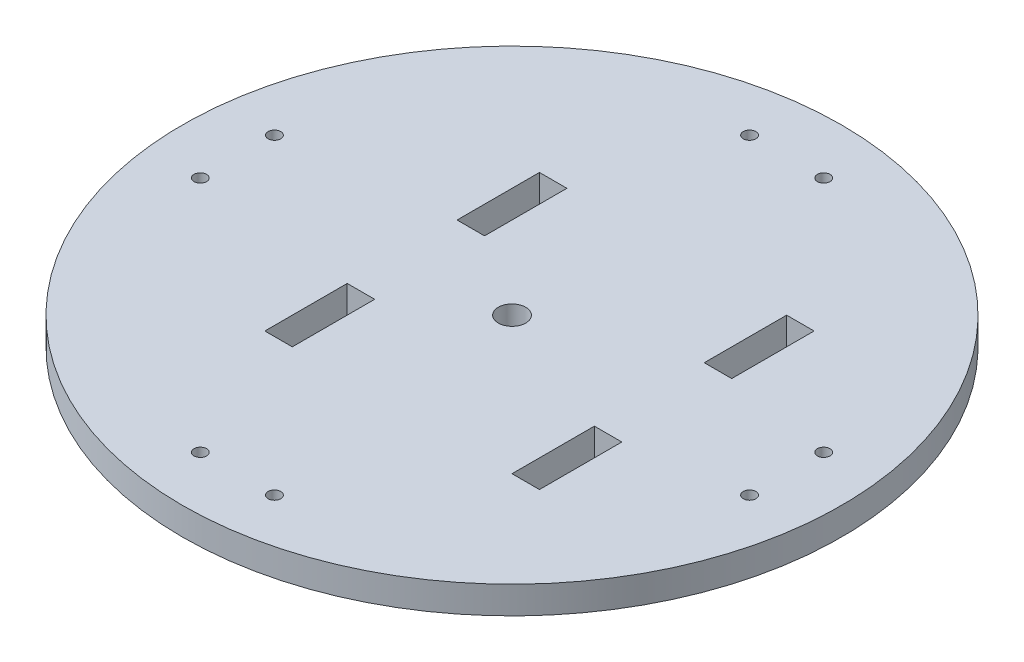
ISO-10303-21;
HEADER;
FILE_DESCRIPTION(('STEP AP214'),'2;1');
FILE_NAME('part.step','',(''),(''),'','','');
FILE_SCHEMA(('AUTOMOTIVE_DESIGN { 1 0 10303 214 1 1 1 1 }'));
ENDSEC;
DATA;
#1=APPLICATION_CONTEXT('core data for automotive mechanical design processes');
#2=APPLICATION_PROTOCOL_DEFINITION('international standard','automotive_design',2000,#1);
#3=PRODUCT_CONTEXT('',#1,'mechanical');
#4=PRODUCT('Part','Part','',(#3));
#5=PRODUCT_RELATED_PRODUCT_CATEGORY('part','',(#4));
#6=PRODUCT_DEFINITION_FORMATION('','',#4);
#7=PRODUCT_DEFINITION_CONTEXT('part definition',#1,'design');
#8=PRODUCT_DEFINITION('design','',#6,#7);
#9=PRODUCT_DEFINITION_SHAPE('','',#8);
#10=(LENGTH_UNIT() NAMED_UNIT(*) SI_UNIT(.MILLI.,.METRE.));
#11=(NAMED_UNIT(*) PLANE_ANGLE_UNIT() SI_UNIT($,.RADIAN.));
#12=(NAMED_UNIT(*) SI_UNIT($,.STERADIAN.) SOLID_ANGLE_UNIT());
#13=UNCERTAINTY_MEASURE_WITH_UNIT(LENGTH_MEASURE(1.E-05),#10,'distance_accuracy_value','');
#14=(GEOMETRIC_REPRESENTATION_CONTEXT(3) GLOBAL_UNCERTAINTY_ASSIGNED_CONTEXT((#13)) GLOBAL_UNIT_ASSIGNED_CONTEXT((#10,
#11,#12)) REPRESENTATION_CONTEXT('',''));
#15=CARTESIAN_POINT('',(0.,0.,0.));
#16=DIRECTION('',(0.,0.,1.));
#17=DIRECTION('',(1.,0.,0.));
#18=AXIS2_PLACEMENT_3D('',#15,#16,#17);
#19=CARTESIAN_POINT('',(0.,5.,0.));
#20=DIRECTION('',(0.,1.,0.));
#21=DIRECTION('',(0.,0.,1.));
#22=AXIS2_PLACEMENT_3D('',#19,#20,#21);
#23=PLANE('',#22);
#24=DIRECTION('',(0.,0.,1.));
#25=VECTOR('',#24,1.);
#26=CARTESIAN_POINT('',(25.,5.,-25.));
#27=LINE('',#26,#25);
#28=CARTESIAN_POINT('',(25.,5.,-25.));
#29=VERTEX_POINT('',#28);
#30=CARTESIAN_POINT('',(25.,5.,-10.));
#31=VERTEX_POINT('',#30);
#32=EDGE_CURVE('E54',#29,#31,#27,.T.);
#33=ORIENTED_EDGE('',*,*,#32,.F.);
#34=DIRECTION('',(-1.,0.,0.));
#35=VECTOR('',#34,1.);
#36=CARTESIAN_POINT('',(25.,5.,-25.));
#37=LINE('',#36,#35);
#38=CARTESIAN_POINT('',(30.,5.,-25.));
#39=VERTEX_POINT('',#38);
#40=EDGE_CURVE('E176',#39,#29,#37,.T.);
#41=ORIENTED_EDGE('',*,*,#40,.F.);
#42=DIRECTION('',(0.,0.,-1.));
#43=VECTOR('',#42,1.);
#44=CARTESIAN_POINT('',(30.,5.,-25.));
#45=LINE('',#44,#43);
#46=CARTESIAN_POINT('',(30.,5.,-10.));
#47=VERTEX_POINT('',#46);
#48=EDGE_CURVE('E180',#47,#39,#45,.T.);
#49=ORIENTED_EDGE('',*,*,#48,.F.);
#50=DIRECTION('',(1.,0.,0.));
#51=VECTOR('',#50,1.);
#52=CARTESIAN_POINT('',(25.,5.,-10.));
#53=LINE('',#52,#51);
#54=EDGE_CURVE('E189',#31,#47,#53,.T.);
#55=ORIENTED_EDGE('',*,*,#54,.F.);
#56=EDGE_LOOP('',(#33,#41,#49,#55));
#57=FACE_BOUND('',#56,.T.);
#58=DIRECTION('',(0.,0.,1.));
#59=VECTOR('',#58,1.);
#60=CARTESIAN_POINT('',(25.,5.,10.));
#61=LINE('',#60,#59);
#62=CARTESIAN_POINT('',(25.,5.,10.));
#63=VERTEX_POINT('',#62);
#64=CARTESIAN_POINT('',(25.,5.,25.));
#65=VERTEX_POINT('',#64);
#66=EDGE_CURVE('E62',#63,#65,#61,.T.);
#67=ORIENTED_EDGE('',*,*,#66,.F.);
#68=DIRECTION('',(-1.,0.,0.));
#69=VECTOR('',#68,1.);
#70=CARTESIAN_POINT('',(25.,5.,10.));
#71=LINE('',#70,#69);
#72=CARTESIAN_POINT('',(30.,5.,10.));
#73=VERTEX_POINT('',#72);
#74=EDGE_CURVE('E210',#73,#63,#71,.T.);
#75=ORIENTED_EDGE('',*,*,#74,.F.);
#76=DIRECTION('',(0.,0.,-1.));
#77=VECTOR('',#76,1.);
#78=CARTESIAN_POINT('',(30.,5.,10.));
#79=LINE('',#78,#77);
#80=CARTESIAN_POINT('',(30.,5.,25.));
#81=VERTEX_POINT('',#80);
#82=EDGE_CURVE('E229',#81,#73,#79,.T.);
#83=ORIENTED_EDGE('',*,*,#82,.F.);
#84=DIRECTION('',(1.,0.,0.));
#85=VECTOR('',#84,1.);
#86=CARTESIAN_POINT('',(25.,5.,25.));
#87=LINE('',#86,#85);
#88=EDGE_CURVE('E225',#65,#81,#87,.T.);
#89=ORIENTED_EDGE('',*,*,#88,.F.);
#90=EDGE_LOOP('',(#67,#75,#83,#89));
#91=FACE_BOUND('',#90,.T.);
#92=DIRECTION('',(0.,0.,1.));
#93=VECTOR('',#92,1.);
#94=CARTESIAN_POINT('',(-20.,5.,-25.));
#95=LINE('',#94,#93);
#96=CARTESIAN_POINT('',(-20.,5.,-25.));
#97=VERTEX_POINT('',#96);
#98=CARTESIAN_POINT('',(-20.,5.,-10.));
#99=VERTEX_POINT('',#98);
#100=EDGE_CURVE('E264',#97,#99,#95,.T.);
#101=ORIENTED_EDGE('',*,*,#100,.F.);
#102=DIRECTION('',(-1.,0.,0.));
#103=VECTOR('',#102,1.);
#104=CARTESIAN_POINT('',(-20.,5.,-25.));
#105=LINE('',#104,#103);
#106=CARTESIAN_POINT('',(-15.,5.,-25.));
#107=VERTEX_POINT('',#106);
#108=EDGE_CURVE('E251',#107,#97,#105,.T.);
#109=ORIENTED_EDGE('',*,*,#108,.F.);
#110=DIRECTION('',(0.,0.,-1.));
#111=VECTOR('',#110,1.);
#112=CARTESIAN_POINT('',(-15.,5.,-25.));
#113=LINE('',#112,#111);
#114=CARTESIAN_POINT('',(-15.,5.,-10.));
#115=VERTEX_POINT('',#114);
#116=EDGE_CURVE('E272',#115,#107,#113,.T.);
#117=ORIENTED_EDGE('',*,*,#116,.F.);
#118=DIRECTION('',(1.,0.,0.));
#119=VECTOR('',#118,1.);
#120=CARTESIAN_POINT('',(-20.,5.,-10.));
#121=LINE('',#120,#119);
#122=EDGE_CURVE('E267',#99,#115,#121,.T.);
#123=ORIENTED_EDGE('',*,*,#122,.F.);
#124=EDGE_LOOP('',(#101,#109,#117,#123));
#125=FACE_BOUND('',#124,.T.);
#126=DIRECTION('',(0.,0.,1.));
#127=VECTOR('',#126,1.);
#128=CARTESIAN_POINT('',(-20.,5.,10.));
#129=LINE('',#128,#127);
#130=CARTESIAN_POINT('',(-20.,5.,10.));
#131=VERTEX_POINT('',#130);
#132=CARTESIAN_POINT('',(-20.,5.,25.));
#133=VERTEX_POINT('',#132);
#134=EDGE_CURVE('E199',#131,#133,#129,.T.);
#135=ORIENTED_EDGE('',*,*,#134,.F.);
#136=DIRECTION('',(-1.,0.,0.));
#137=VECTOR('',#136,1.);
#138=CARTESIAN_POINT('',(-20.,5.,10.));
#139=LINE('',#138,#137);
#140=CARTESIAN_POINT('',(-15.,5.,10.));
#141=VERTEX_POINT('',#140);
#142=EDGE_CURVE('E297',#141,#131,#139,.T.);
#143=ORIENTED_EDGE('',*,*,#142,.F.);
#144=DIRECTION('',(0.,0.,-1.));
#145=VECTOR('',#144,1.);
#146=CARTESIAN_POINT('',(-15.,5.,10.));
#147=LINE('',#146,#145);
#148=CARTESIAN_POINT('',(-15.,5.,25.));
#149=VERTEX_POINT('',#148);
#150=EDGE_CURVE('E316',#149,#141,#147,.T.);
#151=ORIENTED_EDGE('',*,*,#150,.F.);
#152=DIRECTION('',(1.,0.,0.));
#153=VECTOR('',#152,1.);
#154=CARTESIAN_POINT('',(-20.,5.,25.));
#155=LINE('',#154,#153);
#156=EDGE_CURVE('E312',#133,#149,#155,.T.);
#157=ORIENTED_EDGE('',*,*,#156,.F.);
#158=EDGE_LOOP('',(#135,#143,#151,#157));
#159=FACE_BOUND('',#158,.T.);
#160=CARTESIAN_POINT('',(-6.74999999999721,5.,50.0000000000004));
#161=DIRECTION('',(0.,1.,0.));
#162=DIRECTION('',(0.,0.,-1.));
#163=AXIS2_PLACEMENT_3D('',#160,#161,#162);
#164=CIRCLE('',#163,1.14999999999686);
#165=CARTESIAN_POINT('',(-6.74999999999721,5.,48.8500000000035));
#166=VERTEX_POINT('',#165);
#167=EDGE_CURVE('E346',#166,#166,#164,.T.);
#168=ORIENTED_EDGE('',*,*,#167,.F.);
#169=EDGE_LOOP('',(#168));
#170=FACE_BOUND('',#169,.T.);
#171=CARTESIAN_POINT('',(50.0000000000009,5.,-6.7500000000013));
#172=DIRECTION('',(0.,1.,0.));
#173=DIRECTION('',(0.,0.,1.));
#174=AXIS2_PLACEMENT_3D('',#171,#172,#173);
#175=CIRCLE('',#174,1.15);
#176=CARTESIAN_POINT('',(50.0000000000009,5.,-5.6000000000013));
#177=VERTEX_POINT('',#176);
#178=EDGE_CURVE('E363',#177,#177,#175,.T.);
#179=ORIENTED_EDGE('',*,*,#178,.F.);
#180=EDGE_LOOP('',(#179));
#181=FACE_BOUND('',#180,.T.);
#182=CARTESIAN_POINT('',(50.0000000000016,5.,6.7499999999988));
#183=DIRECTION('',(0.,1.,0.));
#184=DIRECTION('',(0.,0.,-1.));
#185=AXIS2_PLACEMENT_3D('',#182,#183,#184);
#186=CIRCLE('',#185,1.14999999999821);
#187=CARTESIAN_POINT('',(50.0000000000016,5.,5.60000000000059));
#188=VERTEX_POINT('',#187);
#189=EDGE_CURVE('E362',#188,#188,#186,.T.);
#190=ORIENTED_EDGE('',*,*,#189,.F.);
#191=EDGE_LOOP('',(#190));
#192=FACE_BOUND('',#191,.T.);
#193=CARTESIAN_POINT('',(6.75000000000001,5.,-50.));
#194=DIRECTION('',(0.,1.,0.));
#195=DIRECTION('',(0.,0.,-1.));
#196=AXIS2_PLACEMENT_3D('',#193,#194,#195);
#197=CIRCLE('',#196,1.15);
#198=CARTESIAN_POINT('',(6.75000000000001,5.,-51.15));
#199=VERTEX_POINT('',#198);
#200=EDGE_CURVE('E379',#199,#199,#197,.T.);
#201=ORIENTED_EDGE('',*,*,#200,.F.);
#202=EDGE_LOOP('',(#201));
#203=FACE_BOUND('',#202,.T.);
#204=CARTESIAN_POINT('',(-49.9999999999987,5.,6.75000000000093));
#205=DIRECTION('',(0.,1.,0.));
#206=DIRECTION('',(0.,0.,1.));
#207=AXIS2_PLACEMENT_3D('',#204,#205,#206);
#208=CIRCLE('',#207,1.15);
#209=CARTESIAN_POINT('',(-49.9999999999987,5.,7.90000000000093));
#210=VERTEX_POINT('',#209);
#211=EDGE_CURVE('E282',#210,#210,#208,.T.);
#212=ORIENTED_EDGE('',*,*,#211,.F.);
#213=EDGE_LOOP('',(#212));
#214=FACE_BOUND('',#213,.T.);
#215=CARTESIAN_POINT('',(-49.9999999999988,5.,-6.74999999999841));
#216=DIRECTION('',(0.,1.,0.));
#217=DIRECTION('',(0.,0.,-1.));
#218=AXIS2_PLACEMENT_3D('',#215,#216,#217);
#219=CIRCLE('',#218,1.14999999999829);
#220=CARTESIAN_POINT('',(-49.9999999999988,5.,-7.8999999999967));
#221=VERTEX_POINT('',#220);
#222=EDGE_CURVE('E338',#221,#221,#219,.T.);
#223=ORIENTED_EDGE('',*,*,#222,.F.);
#224=EDGE_LOOP('',(#223));
#225=FACE_BOUND('',#224,.T.);
#226=CARTESIAN_POINT('',(6.75000000000224,5.,49.9999999999996));
#227=DIRECTION('',(0.,1.,0.));
#228=DIRECTION('',(0.,0.,1.));
#229=AXIS2_PLACEMENT_3D('',#226,#227,#228);
#230=CIRCLE('',#229,1.15);
#231=CARTESIAN_POINT('',(6.75000000000224,5.,51.1499999999996));
#232=VERTEX_POINT('',#231);
#233=EDGE_CURVE('E347',#232,#232,#230,.T.);
#234=ORIENTED_EDGE('',*,*,#233,.F.);
#235=EDGE_LOOP('',(#234));
#236=FACE_BOUND('',#235,.T.);
#237=CARTESIAN_POINT('',(-6.74999999999999,5.,-50.));
#238=DIRECTION('',(0.,1.,0.));
#239=DIRECTION('',(0.,0.,1.));
#240=AXIS2_PLACEMENT_3D('',#237,#238,#239);
#241=CIRCLE('',#240,1.15);
#242=CARTESIAN_POINT('',(-6.74999999999999,5.,-48.85));
#243=VERTEX_POINT('',#242);
#244=EDGE_CURVE('E378',#243,#243,#241,.T.);
#245=ORIENTED_EDGE('',*,*,#244,.F.);
#246=EDGE_LOOP('',(#245));
#247=FACE_BOUND('',#246,.T.);
#248=CARTESIAN_POINT('',(0.,5.,0.));
#249=DIRECTION('',(0.,1.,0.));
#250=DIRECTION('',(0.,0.,1.));
#251=AXIS2_PLACEMENT_3D('',#248,#249,#250);
#252=CIRCLE('',#251,60.);
#253=CARTESIAN_POINT('',(0.,5.,60.));
#254=VERTEX_POINT('',#253);
#255=EDGE_CURVE('E11',#254,#254,#252,.T.);
#256=ORIENTED_EDGE('',*,*,#255,.T.);
#257=EDGE_LOOP('',(#256));
#258=FACE_BOUND('',#257,.T.);
#259=CARTESIAN_POINT('',(0.,5.,0.));
#260=DIRECTION('',(0.,1.,0.));
#261=DIRECTION('',(0.,0.,1.));
#262=AXIS2_PLACEMENT_3D('',#259,#260,#261);
#263=CIRCLE('',#262,2.5);
#264=CARTESIAN_POINT('',(0.,5.,2.5));
#265=VERTEX_POINT('',#264);
#266=EDGE_CURVE('E398',#265,#265,#263,.T.);
#267=ORIENTED_EDGE('',*,*,#266,.F.);
#268=EDGE_LOOP('',(#267));
#269=FACE_BOUND('',#268,.T.);
#270=ADVANCED_FACE('F38',(#57,#91,#125,#159,#170,#181,#192,#203,#214,#225,#236,#247,#258,#269),
#23,.T.);
#271=CARTESIAN_POINT('',(0.,0.,0.));
#272=DIRECTION('',(0.,1.,0.));
#273=DIRECTION('',(0.,0.,1.));
#274=AXIS2_PLACEMENT_3D('',#271,#272,#273);
#275=PLANE('',#274);
#276=DIRECTION('',(-1.,0.,0.));
#277=VECTOR('',#276,1.);
#278=CARTESIAN_POINT('',(25.,0.,-25.));
#279=LINE('',#278,#277);
#280=CARTESIAN_POINT('',(30.,0.,-25.));
#281=VERTEX_POINT('',#280);
#282=CARTESIAN_POINT('',(25.,0.,-25.));
#283=VERTEX_POINT('',#282);
#284=EDGE_CURVE('E161',#281,#283,#279,.T.);
#285=ORIENTED_EDGE('',*,*,#284,.T.);
#286=DIRECTION('',(0.,0.,1.));
#287=VECTOR('',#286,1.);
#288=CARTESIAN_POINT('',(25.,0.,-25.));
#289=LINE('',#288,#287);
#290=CARTESIAN_POINT('',(25.,0.,-10.));
#291=VERTEX_POINT('',#290);
#292=EDGE_CURVE('E154',#283,#291,#289,.T.);
#293=ORIENTED_EDGE('',*,*,#292,.T.);
#294=DIRECTION('',(1.,0.,0.));
#295=VECTOR('',#294,1.);
#296=CARTESIAN_POINT('',(25.,0.,-10.));
#297=LINE('',#296,#295);
#298=CARTESIAN_POINT('',(30.,0.,-10.));
#299=VERTEX_POINT('',#298);
#300=EDGE_CURVE('E165',#291,#299,#297,.T.);
#301=ORIENTED_EDGE('',*,*,#300,.T.);
#302=DIRECTION('',(0.,0.,-1.));
#303=VECTOR('',#302,1.);
#304=CARTESIAN_POINT('',(30.,0.,-25.));
#305=LINE('',#304,#303);
#306=EDGE_CURVE('E170',#299,#281,#305,.T.);
#307=ORIENTED_EDGE('',*,*,#306,.T.);
#308=EDGE_LOOP('',(#285,#293,#301,#307));
#309=FACE_BOUND('',#308,.T.);
#310=DIRECTION('',(-1.,0.,0.));
#311=VECTOR('',#310,1.);
#312=CARTESIAN_POINT('',(25.,0.,10.));
#313=LINE('',#312,#311);
#314=CARTESIAN_POINT('',(30.,0.,10.));
#315=VERTEX_POINT('',#314);
#316=CARTESIAN_POINT('',(25.,0.,10.));
#317=VERTEX_POINT('',#316);
#318=EDGE_CURVE('E218',#315,#317,#313,.T.);
#319=ORIENTED_EDGE('',*,*,#318,.T.);
#320=DIRECTION('',(0.,0.,1.));
#321=VECTOR('',#320,1.);
#322=CARTESIAN_POINT('',(25.,0.,10.));
#323=LINE('',#322,#321);
#324=CARTESIAN_POINT('',(25.,0.,25.));
#325=VERTEX_POINT('',#324);
#326=EDGE_CURVE('E205',#317,#325,#323,.T.);
#327=ORIENTED_EDGE('',*,*,#326,.T.);
#328=DIRECTION('',(1.,0.,0.));
#329=VECTOR('',#328,1.);
#330=CARTESIAN_POINT('',(25.,0.,25.));
#331=LINE('',#330,#329);
#332=CARTESIAN_POINT('',(30.,0.,25.));
#333=VERTEX_POINT('',#332);
#334=EDGE_CURVE('E209',#325,#333,#331,.T.);
#335=ORIENTED_EDGE('',*,*,#334,.T.);
#336=DIRECTION('',(0.,0.,-1.));
#337=VECTOR('',#336,1.);
#338=CARTESIAN_POINT('',(30.,0.,10.));
#339=LINE('',#338,#337);
#340=EDGE_CURVE('E214',#333,#315,#339,.T.);
#341=ORIENTED_EDGE('',*,*,#340,.T.);
#342=EDGE_LOOP('',(#319,#327,#335,#341));
#343=FACE_BOUND('',#342,.T.);
#344=DIRECTION('',(-1.,0.,0.));
#345=VECTOR('',#344,1.);
#346=CARTESIAN_POINT('',(-20.,0.,-25.));
#347=LINE('',#346,#345);
#348=CARTESIAN_POINT('',(-15.,0.,-25.));
#349=VERTEX_POINT('',#348);
#350=CARTESIAN_POINT('',(-20.,0.,-25.));
#351=VERTEX_POINT('',#350);
#352=EDGE_CURVE('E259',#349,#351,#347,.T.);
#353=ORIENTED_EDGE('',*,*,#352,.T.);
#354=DIRECTION('',(0.,0.,1.));
#355=VECTOR('',#354,1.);
#356=CARTESIAN_POINT('',(-20.,0.,-25.));
#357=LINE('',#356,#355);
#358=CARTESIAN_POINT('',(-20.,0.,-10.));
#359=VERTEX_POINT('',#358);
#360=EDGE_CURVE('E246',#351,#359,#357,.T.);
#361=ORIENTED_EDGE('',*,*,#360,.T.);
#362=DIRECTION('',(1.,0.,0.));
#363=VECTOR('',#362,1.);
#364=CARTESIAN_POINT('',(-20.,0.,-10.));
#365=LINE('',#364,#363);
#366=CARTESIAN_POINT('',(-15.,0.,-10.));
#367=VERTEX_POINT('',#366);
#368=EDGE_CURVE('E250',#359,#367,#365,.T.);
#369=ORIENTED_EDGE('',*,*,#368,.T.);
#370=DIRECTION('',(0.,0.,-1.));
#371=VECTOR('',#370,1.);
#372=CARTESIAN_POINT('',(-15.,0.,-25.));
#373=LINE('',#372,#371);
#374=EDGE_CURVE('E255',#367,#349,#373,.T.);
#375=ORIENTED_EDGE('',*,*,#374,.T.);
#376=EDGE_LOOP('',(#353,#361,#369,#375));
#377=FACE_BOUND('',#376,.T.);
#378=DIRECTION('',(-1.,0.,0.));
#379=VECTOR('',#378,1.);
#380=CARTESIAN_POINT('',(-20.,0.,10.));
#381=LINE('',#380,#379);
#382=CARTESIAN_POINT('',(-15.,0.,10.));
#383=VERTEX_POINT('',#382);
#384=CARTESIAN_POINT('',(-20.,0.,10.));
#385=VERTEX_POINT('',#384);
#386=EDGE_CURVE('E305',#383,#385,#381,.T.);
#387=ORIENTED_EDGE('',*,*,#386,.T.);
#388=DIRECTION('',(0.,0.,1.));
#389=VECTOR('',#388,1.);
#390=CARTESIAN_POINT('',(-20.,0.,10.));
#391=LINE('',#390,#389);
#392=CARTESIAN_POINT('',(-20.,0.,25.));
#393=VERTEX_POINT('',#392);
#394=EDGE_CURVE('E292',#385,#393,#391,.T.);
#395=ORIENTED_EDGE('',*,*,#394,.T.);
#396=DIRECTION('',(1.,0.,0.));
#397=VECTOR('',#396,1.);
#398=CARTESIAN_POINT('',(-20.,0.,25.));
#399=LINE('',#398,#397);
#400=CARTESIAN_POINT('',(-15.,0.,25.));
#401=VERTEX_POINT('',#400);
#402=EDGE_CURVE('E296',#393,#401,#399,.T.);
#403=ORIENTED_EDGE('',*,*,#402,.T.);
#404=DIRECTION('',(0.,0.,-1.));
#405=VECTOR('',#404,1.);
#406=CARTESIAN_POINT('',(-15.,0.,10.));
#407=LINE('',#406,#405);
#408=EDGE_CURVE('E301',#401,#383,#407,.T.);
#409=ORIENTED_EDGE('',*,*,#408,.T.);
#410=EDGE_LOOP('',(#387,#395,#403,#409));
#411=FACE_BOUND('',#410,.T.);
#412=CARTESIAN_POINT('',(-6.74999999999721,0.,50.0000000000004));
#413=DIRECTION('',(0.,1.,0.));
#414=DIRECTION('',(0.,0.,-1.));
#415=AXIS2_PLACEMENT_3D('',#412,#413,#414);
#416=CIRCLE('',#415,1.14999999999686);
#417=CARTESIAN_POINT('',(-6.74999999999721,0.,48.8500000000035));
#418=VERTEX_POINT('',#417);
#419=EDGE_CURVE('E367',#418,#418,#416,.T.);
#420=ORIENTED_EDGE('',*,*,#419,.T.);
#421=EDGE_LOOP('',(#420));
#422=FACE_BOUND('',#421,.T.);
#423=CARTESIAN_POINT('',(50.0000000000009,0.,-6.7500000000013));
#424=DIRECTION('',(0.,1.,0.));
#425=DIRECTION('',(0.,0.,1.));
#426=AXIS2_PLACEMENT_3D('',#423,#424,#425);
#427=CIRCLE('',#426,1.15);
#428=CARTESIAN_POINT('',(50.0000000000009,0.,-5.6000000000013));
#429=VERTEX_POINT('',#428);
#430=EDGE_CURVE('E358',#429,#429,#427,.T.);
#431=ORIENTED_EDGE('',*,*,#430,.T.);
#432=EDGE_LOOP('',(#431));
#433=FACE_BOUND('',#432,.T.);
#434=CARTESIAN_POINT('',(50.0000000000016,0.,6.7499999999988));
#435=DIRECTION('',(0.,1.,0.));
#436=DIRECTION('',(0.,0.,-1.));
#437=AXIS2_PLACEMENT_3D('',#434,#435,#436);
#438=CIRCLE('',#437,1.14999999999821);
#439=CARTESIAN_POINT('',(50.0000000000016,0.,5.60000000000059));
#440=VERTEX_POINT('',#439);
#441=EDGE_CURVE('E383',#440,#440,#438,.T.);
#442=ORIENTED_EDGE('',*,*,#441,.T.);
#443=EDGE_LOOP('',(#442));
#444=FACE_BOUND('',#443,.T.);
#445=CARTESIAN_POINT('',(6.75000000000001,0.,-50.));
#446=DIRECTION('',(0.,1.,0.));
#447=DIRECTION('',(0.,0.,-1.));
#448=AXIS2_PLACEMENT_3D('',#445,#446,#447);
#449=CIRCLE('',#448,1.15);
#450=CARTESIAN_POINT('',(6.75000000000001,0.,-51.15));
#451=VERTEX_POINT('',#450);
#452=EDGE_CURVE('E374',#451,#451,#449,.T.);
#453=ORIENTED_EDGE('',*,*,#452,.T.);
#454=EDGE_LOOP('',(#453));
#455=FACE_BOUND('',#454,.T.);
#456=CARTESIAN_POINT('',(-49.9999999999987,0.,6.75000000000093));
#457=DIRECTION('',(0.,1.,0.));
#458=DIRECTION('',(0.,0.,1.));
#459=AXIS2_PLACEMENT_3D('',#456,#457,#458);
#460=CIRCLE('',#459,1.15);
#461=CARTESIAN_POINT('',(-49.9999999999987,0.,7.90000000000093));
#462=VERTEX_POINT('',#461);
#463=EDGE_CURVE('E334',#462,#462,#460,.T.);
#464=ORIENTED_EDGE('',*,*,#463,.T.);
#465=EDGE_LOOP('',(#464));
#466=FACE_BOUND('',#465,.T.);
#467=CARTESIAN_POINT('',(-49.9999999999988,0.,-6.74999999999841));
#468=DIRECTION('',(0.,1.,0.));
#469=DIRECTION('',(0.,0.,-1.));
#470=AXIS2_PLACEMENT_3D('',#467,#468,#469);
#471=CIRCLE('',#470,1.14999999999829);
#472=CARTESIAN_POINT('',(-49.9999999999988,0.,-7.8999999999967));
#473=VERTEX_POINT('',#472);
#474=EDGE_CURVE('E351',#473,#473,#471,.T.);
#475=ORIENTED_EDGE('',*,*,#474,.T.);
#476=EDGE_LOOP('',(#475));
#477=FACE_BOUND('',#476,.T.);
#478=CARTESIAN_POINT('',(6.75000000000224,0.,49.9999999999996));
#479=DIRECTION('',(0.,1.,0.));
#480=DIRECTION('',(0.,0.,1.));
#481=AXIS2_PLACEMENT_3D('',#478,#479,#480);
#482=CIRCLE('',#481,1.15);
#483=CARTESIAN_POINT('',(6.75000000000224,0.,51.1499999999996));
#484=VERTEX_POINT('',#483);
#485=EDGE_CURVE('E342',#484,#484,#482,.T.);
#486=ORIENTED_EDGE('',*,*,#485,.T.);
#487=EDGE_LOOP('',(#486));
#488=FACE_BOUND('',#487,.T.);
#489=CARTESIAN_POINT('',(-6.74999999999999,0.,-50.));
#490=DIRECTION('',(0.,1.,0.));
#491=DIRECTION('',(0.,0.,1.));
#492=AXIS2_PLACEMENT_3D('',#489,#490,#491);
#493=CIRCLE('',#492,1.15);
#494=CARTESIAN_POINT('',(-6.74999999999999,0.,-48.85));
#495=VERTEX_POINT('',#494);
#496=EDGE_CURVE('E390',#495,#495,#493,.T.);
#497=ORIENTED_EDGE('',*,*,#496,.T.);
#498=EDGE_LOOP('',(#497));
#499=FACE_BOUND('',#498,.T.);
#500=CARTESIAN_POINT('',(0.,0.,0.));
#501=DIRECTION('',(0.,1.,0.));
#502=DIRECTION('',(0.,0.,1.));
#503=AXIS2_PLACEMENT_3D('',#500,#501,#502);
#504=CIRCLE('',#503,60.);
#505=CARTESIAN_POINT('',(0.,0.,60.));
#506=VERTEX_POINT('',#505);
#507=EDGE_CURVE('E42',#506,#506,#504,.T.);
#508=ORIENTED_EDGE('',*,*,#507,.F.);
#509=EDGE_LOOP('',(#508));
#510=FACE_BOUND('',#509,.T.);
#511=CARTESIAN_POINT('',(0.,0.,0.));
#512=DIRECTION('',(0.,1.,0.));
#513=DIRECTION('',(0.,0.,1.));
#514=AXIS2_PLACEMENT_3D('',#511,#512,#513);
#515=CIRCLE('',#514,2.5);
#516=CARTESIAN_POINT('',(0.,0.,2.5));
#517=VERTEX_POINT('',#516);
#518=EDGE_CURVE('E394',#517,#517,#515,.T.);
#519=ORIENTED_EDGE('',*,*,#518,.T.);
#520=EDGE_LOOP('',(#519));
#521=FACE_BOUND('',#520,.T.);
#522=ADVANCED_FACE('F172',(#309,#343,#377,#411,#422,#433,#444,#455,#466,#477,#488,#499,#510,
#521),#275,.F.);
#523=CARTESIAN_POINT('',(0.,5.,0.));
#524=DIRECTION('',(0.,-1.,0.));
#525=DIRECTION('',(0.,0.,-1.));
#526=AXIS2_PLACEMENT_3D('',#523,#524,#525);
#527=CYLINDRICAL_SURFACE('',#526,60.);
#528=ORIENTED_EDGE('',*,*,#255,.F.);
#529=EDGE_LOOP('',(#528));
#530=FACE_BOUND('',#529,.T.);
#531=ORIENTED_EDGE('',*,*,#507,.T.);
#532=EDGE_LOOP('',(#531));
#533=FACE_BOUND('',#532,.T.);
#534=ADVANCED_FACE('F40',(#530,#533),#527,.T.);
#535=CARTESIAN_POINT('',(0.,5.,0.));
#536=DIRECTION('',(0.,-1.,0.));
#537=DIRECTION('',(0.,0.,-1.));
#538=AXIS2_PLACEMENT_3D('',#535,#536,#537);
#539=CYLINDRICAL_SURFACE('',#538,2.5);
#540=ORIENTED_EDGE('',*,*,#266,.T.);
#541=EDGE_LOOP('',(#540));
#542=FACE_BOUND('',#541,.T.);
#543=ORIENTED_EDGE('',*,*,#518,.F.);
#544=EDGE_LOOP('',(#543));
#545=FACE_BOUND('',#544,.T.);
#546=ADVANCED_FACE('F407',(#542,#545),#539,.F.);
#547=CARTESIAN_POINT('',(-6.74999999999999,0.,-50.));
#548=DIRECTION('',(0.,1.,0.));
#549=DIRECTION('',(0.,0.,1.));
#550=AXIS2_PLACEMENT_3D('',#547,#548,#549);
#551=CYLINDRICAL_SURFACE('',#550,1.15);
#552=ORIENTED_EDGE('',*,*,#496,.F.);
#553=EDGE_LOOP('',(#552));
#554=FACE_BOUND('',#553,.T.);
#555=ORIENTED_EDGE('',*,*,#244,.T.);
#556=EDGE_LOOP('',(#555));
#557=FACE_BOUND('',#556,.T.);
#558=ADVANCED_FACE('F409',(#554,#557),#551,.F.);
#559=CARTESIAN_POINT('',(6.75000000000224,0.,49.9999999999996));
#560=DIRECTION('',(0.,1.,0.));
#561=DIRECTION('',(0.,0.,1.));
#562=AXIS2_PLACEMENT_3D('',#559,#560,#561);
#563=CYLINDRICAL_SURFACE('',#562,1.15);
#564=ORIENTED_EDGE('',*,*,#485,.F.);
#565=EDGE_LOOP('',(#564));
#566=FACE_BOUND('',#565,.T.);
#567=ORIENTED_EDGE('',*,*,#233,.T.);
#568=EDGE_LOOP('',(#567));
#569=FACE_BOUND('',#568,.T.);
#570=ADVANCED_FACE('F416',(#566,#569),#563,.F.);
#571=CARTESIAN_POINT('',(-49.9999999999988,0.,-6.74999999999841));
#572=DIRECTION('',(0.,1.,0.));
#573=DIRECTION('',(0.,0.,1.));
#574=AXIS2_PLACEMENT_3D('',#571,#572,#573);
#575=CYLINDRICAL_SURFACE('',#574,1.14999999999829);
#576=ORIENTED_EDGE('',*,*,#474,.F.);
#577=EDGE_LOOP('',(#576));
#578=FACE_BOUND('',#577,.T.);
#579=ORIENTED_EDGE('',*,*,#222,.T.);
#580=EDGE_LOOP('',(#579));
#581=FACE_BOUND('',#580,.T.);
#582=ADVANCED_FACE('F467',(#578,#581),#575,.F.);
#583=CARTESIAN_POINT('',(-49.9999999999987,0.,6.75000000000093));
#584=DIRECTION('',(0.,1.,0.));
#585=DIRECTION('',(0.,0.,1.));
#586=AXIS2_PLACEMENT_3D('',#583,#584,#585);
#587=CYLINDRICAL_SURFACE('',#586,1.15);
#588=ORIENTED_EDGE('',*,*,#463,.F.);
#589=EDGE_LOOP('',(#588));
#590=FACE_BOUND('',#589,.T.);
#591=ORIENTED_EDGE('',*,*,#211,.T.);
#592=EDGE_LOOP('',(#591));
#593=FACE_BOUND('',#592,.T.);
#594=ADVANCED_FACE('F473',(#590,#593),#587,.F.);
#595=CARTESIAN_POINT('',(6.75000000000001,0.,-50.));
#596=DIRECTION('',(0.,1.,0.));
#597=DIRECTION('',(0.,0.,1.));
#598=AXIS2_PLACEMENT_3D('',#595,#596,#597);
#599=CYLINDRICAL_SURFACE('',#598,1.15);
#600=ORIENTED_EDGE('',*,*,#452,.F.);
#601=EDGE_LOOP('',(#600));
#602=FACE_BOUND('',#601,.T.);
#603=ORIENTED_EDGE('',*,*,#200,.T.);
#604=EDGE_LOOP('',(#603));
#605=FACE_BOUND('',#604,.T.);
#606=ADVANCED_FACE('F490',(#602,#605),#599,.F.);
#607=CARTESIAN_POINT('',(50.0000000000016,0.,6.7499999999988));
#608=DIRECTION('',(0.,1.,0.));
#609=DIRECTION('',(0.,0.,1.));
#610=AXIS2_PLACEMENT_3D('',#607,#608,#609);
#611=CYLINDRICAL_SURFACE('',#610,1.14999999999821);
#612=ORIENTED_EDGE('',*,*,#441,.F.);
#613=EDGE_LOOP('',(#612));
#614=FACE_BOUND('',#613,.T.);
#615=ORIENTED_EDGE('',*,*,#189,.T.);
#616=EDGE_LOOP('',(#615));
#617=FACE_BOUND('',#616,.T.);
#618=ADVANCED_FACE('F484',(#614,#617),#611,.F.);
#619=CARTESIAN_POINT('',(50.0000000000009,0.,-6.7500000000013));
#620=DIRECTION('',(0.,1.,0.));
#621=DIRECTION('',(0.,0.,1.));
#622=AXIS2_PLACEMENT_3D('',#619,#620,#621);
#623=CYLINDRICAL_SURFACE('',#622,1.15);
#624=ORIENTED_EDGE('',*,*,#430,.F.);
#625=EDGE_LOOP('',(#624));
#626=FACE_BOUND('',#625,.T.);
#627=ORIENTED_EDGE('',*,*,#178,.T.);
#628=EDGE_LOOP('',(#627));
#629=FACE_BOUND('',#628,.T.);
#630=ADVANCED_FACE('F480',(#626,#629),#623,.F.);
#631=CARTESIAN_POINT('',(-6.74999999999721,0.,50.0000000000004));
#632=DIRECTION('',(0.,1.,0.));
#633=DIRECTION('',(0.,0.,1.));
#634=AXIS2_PLACEMENT_3D('',#631,#632,#633);
#635=CYLINDRICAL_SURFACE('',#634,1.14999999999686);
#636=ORIENTED_EDGE('',*,*,#419,.F.);
#637=EDGE_LOOP('',(#636));
#638=FACE_BOUND('',#637,.T.);
#639=ORIENTED_EDGE('',*,*,#167,.T.);
#640=EDGE_LOOP('',(#639));
#641=FACE_BOUND('',#640,.T.);
#642=ADVANCED_FACE('F483',(#638,#641),#635,.F.);
#643=CARTESIAN_POINT('',(-20.,0.,10.));
#644=DIRECTION('',(-1.,0.,0.));
#645=DIRECTION('',(0.,0.,1.));
#646=AXIS2_PLACEMENT_3D('',#643,#644,#645);
#647=PLANE('',#646);
#648=ORIENTED_EDGE('',*,*,#134,.T.);
#649=DIRECTION('',(0.,1.,0.));
#650=VECTOR('',#649,1.);
#651=CARTESIAN_POINT('',(-20.,0.,25.));
#652=LINE('',#651,#650);
#653=EDGE_CURVE('E309',#393,#133,#652,.T.);
#654=ORIENTED_EDGE('',*,*,#653,.F.);
#655=ORIENTED_EDGE('',*,*,#394,.F.);
#656=DIRECTION('',(0.,1.,0.));
#657=VECTOR('',#656,1.);
#658=CARTESIAN_POINT('',(-20.,0.,10.));
#659=LINE('',#658,#657);
#660=EDGE_CURVE('E268',#385,#131,#659,.T.);
#661=ORIENTED_EDGE('',*,*,#660,.T.);
#662=EDGE_LOOP('',(#648,#654,#655,#661));
#663=FACE_BOUND('',#662,.T.);
#664=ADVANCED_FACE('F488',(#663),#647,.F.);
#665=CARTESIAN_POINT('',(-20.,0.,10.));
#666=DIRECTION('',(0.,0.,-1.));
#667=DIRECTION('',(-1.,0.,0.));
#668=AXIS2_PLACEMENT_3D('',#665,#666,#667);
#669=PLANE('',#668);
#670=ORIENTED_EDGE('',*,*,#142,.T.);
#671=ORIENTED_EDGE('',*,*,#660,.F.);
#672=ORIENTED_EDGE('',*,*,#386,.F.);
#673=DIRECTION('',(0.,1.,0.));
#674=VECTOR('',#673,1.);
#675=CARTESIAN_POINT('',(-15.,0.,10.));
#676=LINE('',#675,#674);
#677=EDGE_CURVE('E325',#383,#141,#676,.T.);
#678=ORIENTED_EDGE('',*,*,#677,.T.);
#679=EDGE_LOOP('',(#670,#671,#672,#678));
#680=FACE_BOUND('',#679,.T.);
#681=ADVANCED_FACE('F547',(#680),#669,.F.);
#682=CARTESIAN_POINT('',(-15.,0.,10.));
#683=DIRECTION('',(1.,0.,0.));
#684=DIRECTION('',(0.,0.,-1.));
#685=AXIS2_PLACEMENT_3D('',#682,#683,#684);
#686=PLANE('',#685);
#687=ORIENTED_EDGE('',*,*,#150,.T.);
#688=ORIENTED_EDGE('',*,*,#677,.F.);
#689=ORIENTED_EDGE('',*,*,#408,.F.);
#690=DIRECTION('',(0.,1.,0.));
#691=VECTOR('',#690,1.);
#692=CARTESIAN_POINT('',(-15.,0.,25.));
#693=LINE('',#692,#691);
#694=EDGE_CURVE('E328',#401,#149,#693,.T.);
#695=ORIENTED_EDGE('',*,*,#694,.T.);
#696=EDGE_LOOP('',(#687,#688,#689,#695));
#697=FACE_BOUND('',#696,.T.);
#698=ADVANCED_FACE('F556',(#697),#686,.F.);
#699=CARTESIAN_POINT('',(-20.,0.,25.));
#700=DIRECTION('',(0.,0.,1.));
#701=DIRECTION('',(1.,0.,0.));
#702=AXIS2_PLACEMENT_3D('',#699,#700,#701);
#703=PLANE('',#702);
#704=ORIENTED_EDGE('',*,*,#156,.T.);
#705=ORIENTED_EDGE('',*,*,#694,.F.);
#706=ORIENTED_EDGE('',*,*,#402,.F.);
#707=ORIENTED_EDGE('',*,*,#653,.T.);
#708=EDGE_LOOP('',(#704,#705,#706,#707));
#709=FACE_BOUND('',#708,.T.);
#710=ADVANCED_FACE('F566',(#709),#703,.F.);
#711=CARTESIAN_POINT('',(-20.,0.,-25.));
#712=DIRECTION('',(-1.,0.,0.));
#713=DIRECTION('',(0.,0.,1.));
#714=AXIS2_PLACEMENT_3D('',#711,#712,#713);
#715=PLANE('',#714);
#716=ORIENTED_EDGE('',*,*,#100,.T.);
#717=DIRECTION('',(0.,1.,0.));
#718=VECTOR('',#717,1.);
#719=CARTESIAN_POINT('',(-20.,0.,-10.));
#720=LINE('',#719,#718);
#721=EDGE_CURVE('E263',#359,#99,#720,.T.);
#722=ORIENTED_EDGE('',*,*,#721,.F.);
#723=ORIENTED_EDGE('',*,*,#360,.F.);
#724=DIRECTION('',(0.,1.,0.));
#725=VECTOR('',#724,1.);
#726=CARTESIAN_POINT('',(-20.,0.,-25.));
#727=LINE('',#726,#725);
#728=EDGE_CURVE('E279',#351,#97,#727,.T.);
#729=ORIENTED_EDGE('',*,*,#728,.T.);
#730=EDGE_LOOP('',(#716,#722,#723,#729));
#731=FACE_BOUND('',#730,.T.);
#732=ADVANCED_FACE('F576',(#731),#715,.F.);
#733=CARTESIAN_POINT('',(-20.,0.,-25.));
#734=DIRECTION('',(0.,0.,-1.));
#735=DIRECTION('',(-1.,0.,0.));
#736=AXIS2_PLACEMENT_3D('',#733,#734,#735);
#737=PLANE('',#736);
#738=ORIENTED_EDGE('',*,*,#108,.T.);
#739=ORIENTED_EDGE('',*,*,#728,.F.);
#740=ORIENTED_EDGE('',*,*,#352,.F.);
#741=DIRECTION('',(0.,1.,0.));
#742=VECTOR('',#741,1.);
#743=CARTESIAN_POINT('',(-15.,0.,-25.));
#744=LINE('',#743,#742);
#745=EDGE_CURVE('E283',#349,#107,#744,.T.);
#746=ORIENTED_EDGE('',*,*,#745,.T.);
#747=EDGE_LOOP('',(#738,#739,#740,#746));
#748=FACE_BOUND('',#747,.T.);
#749=ADVANCED_FACE('F586',(#748),#737,.F.);
#750=CARTESIAN_POINT('',(-15.,0.,-25.));
#751=DIRECTION('',(1.,0.,0.));
#752=DIRECTION('',(0.,0.,-1.));
#753=AXIS2_PLACEMENT_3D('',#750,#751,#752);
#754=PLANE('',#753);
#755=ORIENTED_EDGE('',*,*,#116,.T.);
#756=ORIENTED_EDGE('',*,*,#745,.F.);
#757=ORIENTED_EDGE('',*,*,#374,.F.);
#758=DIRECTION('',(0.,1.,0.));
#759=VECTOR('',#758,1.);
#760=CARTESIAN_POINT('',(-15.,0.,-10.));
#761=LINE('',#760,#759);
#762=EDGE_CURVE('E286',#367,#115,#761,.T.);
#763=ORIENTED_EDGE('',*,*,#762,.T.);
#764=EDGE_LOOP('',(#755,#756,#757,#763));
#765=FACE_BOUND('',#764,.T.);
#766=ADVANCED_FACE('F596',(#765),#754,.F.);
#767=CARTESIAN_POINT('',(-20.,0.,-10.));
#768=DIRECTION('',(0.,0.,1.));
#769=DIRECTION('',(1.,0.,0.));
#770=AXIS2_PLACEMENT_3D('',#767,#768,#769);
#771=PLANE('',#770);
#772=ORIENTED_EDGE('',*,*,#122,.T.);
#773=ORIENTED_EDGE('',*,*,#762,.F.);
#774=ORIENTED_EDGE('',*,*,#368,.F.);
#775=ORIENTED_EDGE('',*,*,#721,.T.);
#776=EDGE_LOOP('',(#772,#773,#774,#775));
#777=FACE_BOUND('',#776,.T.);
#778=ADVANCED_FACE('F605',(#777),#771,.F.);
#779=CARTESIAN_POINT('',(25.,0.,10.));
#780=DIRECTION('',(-1.,0.,0.));
#781=DIRECTION('',(0.,0.,1.));
#782=AXIS2_PLACEMENT_3D('',#779,#780,#781);
#783=PLANE('',#782);
#784=ORIENTED_EDGE('',*,*,#66,.T.);
#785=DIRECTION('',(0.,1.,0.));
#786=VECTOR('',#785,1.);
#787=CARTESIAN_POINT('',(25.,0.,25.));
#788=LINE('',#787,#786);
#789=EDGE_CURVE('E222',#325,#65,#788,.T.);
#790=ORIENTED_EDGE('',*,*,#789,.F.);
#791=ORIENTED_EDGE('',*,*,#326,.F.);
#792=DIRECTION('',(0.,1.,0.));
#793=VECTOR('',#792,1.);
#794=CARTESIAN_POINT('',(25.,0.,10.));
#795=LINE('',#794,#793);
#796=EDGE_CURVE('E190',#317,#63,#795,.T.);
#797=ORIENTED_EDGE('',*,*,#796,.T.);
#798=EDGE_LOOP('',(#784,#790,#791,#797));
#799=FACE_BOUND('',#798,.T.);
#800=ADVANCED_FACE('F614',(#799),#783,.F.);
#801=CARTESIAN_POINT('',(25.,0.,10.));
#802=DIRECTION('',(0.,0.,-1.));
#803=DIRECTION('',(-1.,0.,0.));
#804=AXIS2_PLACEMENT_3D('',#801,#802,#803);
#805=PLANE('',#804);
#806=ORIENTED_EDGE('',*,*,#74,.T.);
#807=ORIENTED_EDGE('',*,*,#796,.F.);
#808=ORIENTED_EDGE('',*,*,#318,.F.);
#809=DIRECTION('',(0.,1.,0.));
#810=VECTOR('',#809,1.);
#811=CARTESIAN_POINT('',(30.,0.,10.));
#812=LINE('',#811,#810);
#813=EDGE_CURVE('E238',#315,#73,#812,.T.);
#814=ORIENTED_EDGE('',*,*,#813,.T.);
#815=EDGE_LOOP('',(#806,#807,#808,#814));
#816=FACE_BOUND('',#815,.T.);
#817=ADVANCED_FACE('F625',(#816),#805,.F.);
#818=CARTESIAN_POINT('',(30.,0.,10.));
#819=DIRECTION('',(1.,0.,0.));
#820=DIRECTION('',(0.,0.,-1.));
#821=AXIS2_PLACEMENT_3D('',#818,#819,#820);
#822=PLANE('',#821);
#823=ORIENTED_EDGE('',*,*,#82,.T.);
#824=ORIENTED_EDGE('',*,*,#813,.F.);
#825=ORIENTED_EDGE('',*,*,#340,.F.);
#826=DIRECTION('',(0.,1.,0.));
#827=VECTOR('',#826,1.);
#828=CARTESIAN_POINT('',(30.,0.,25.));
#829=LINE('',#828,#827);
#830=EDGE_CURVE('E241',#333,#81,#829,.T.);
#831=ORIENTED_EDGE('',*,*,#830,.T.);
#832=EDGE_LOOP('',(#823,#824,#825,#831));
#833=FACE_BOUND('',#832,.T.);
#834=ADVANCED_FACE('F631',(#833),#822,.F.);
#835=CARTESIAN_POINT('',(25.,0.,25.));
#836=DIRECTION('',(0.,0.,1.));
#837=DIRECTION('',(1.,0.,0.));
#838=AXIS2_PLACEMENT_3D('',#835,#836,#837);
#839=PLANE('',#838);
#840=ORIENTED_EDGE('',*,*,#88,.T.);
#841=ORIENTED_EDGE('',*,*,#830,.F.);
#842=ORIENTED_EDGE('',*,*,#334,.F.);
#843=ORIENTED_EDGE('',*,*,#789,.T.);
#844=EDGE_LOOP('',(#840,#841,#842,#843));
#845=FACE_BOUND('',#844,.T.);
#846=ADVANCED_FACE('F639',(#845),#839,.F.);
#847=CARTESIAN_POINT('',(25.,0.,-25.));
#848=DIRECTION('',(-1.,0.,0.));
#849=DIRECTION('',(0.,0.,1.));
#850=AXIS2_PLACEMENT_3D('',#847,#848,#849);
#851=PLANE('',#850);
#852=ORIENTED_EDGE('',*,*,#32,.T.);
#853=DIRECTION('',(0.,1.,0.));
#854=VECTOR('',#853,1.);
#855=CARTESIAN_POINT('',(25.,0.,-10.));
#856=LINE('',#855,#854);
#857=EDGE_CURVE('E150',#291,#31,#856,.T.);
#858=ORIENTED_EDGE('',*,*,#857,.F.);
#859=ORIENTED_EDGE('',*,*,#292,.F.);
#860=DIRECTION('',(0.,1.,0.));
#861=VECTOR('',#860,1.);
#862=CARTESIAN_POINT('',(25.,0.,-25.));
#863=LINE('',#862,#861);
#864=EDGE_CURVE('E196',#283,#29,#863,.T.);
#865=ORIENTED_EDGE('',*,*,#864,.T.);
#866=EDGE_LOOP('',(#852,#858,#859,#865));
#867=FACE_BOUND('',#866,.T.);
#868=ADVANCED_FACE('F152',(#867),#851,.F.);
#869=CARTESIAN_POINT('',(25.,0.,-25.));
#870=DIRECTION('',(0.,0.,-1.));
#871=DIRECTION('',(-1.,0.,0.));
#872=AXIS2_PLACEMENT_3D('',#869,#870,#871);
#873=PLANE('',#872);
#874=ORIENTED_EDGE('',*,*,#40,.T.);
#875=ORIENTED_EDGE('',*,*,#864,.F.);
#876=ORIENTED_EDGE('',*,*,#284,.F.);
#877=DIRECTION('',(0.,1.,0.));
#878=VECTOR('',#877,1.);
#879=CARTESIAN_POINT('',(30.,0.,-25.));
#880=LINE('',#879,#878);
#881=EDGE_CURVE('E200',#281,#39,#880,.T.);
#882=ORIENTED_EDGE('',*,*,#881,.T.);
#883=EDGE_LOOP('',(#874,#875,#876,#882));
#884=FACE_BOUND('',#883,.T.);
#885=ADVANCED_FACE('F654',(#884),#873,.F.);
#886=CARTESIAN_POINT('',(30.,0.,-25.));
#887=DIRECTION('',(1.,0.,0.));
#888=DIRECTION('',(0.,0.,-1.));
#889=AXIS2_PLACEMENT_3D('',#886,#887,#888);
#890=PLANE('',#889);
#891=ORIENTED_EDGE('',*,*,#48,.T.);
#892=ORIENTED_EDGE('',*,*,#881,.F.);
#893=ORIENTED_EDGE('',*,*,#306,.F.);
#894=DIRECTION('',(0.,1.,0.));
#895=VECTOR('',#894,1.);
#896=CARTESIAN_POINT('',(30.,0.,-10.));
#897=LINE('',#896,#895);
#898=EDGE_CURVE('E160',#299,#47,#897,.T.);
#899=ORIENTED_EDGE('',*,*,#898,.T.);
#900=EDGE_LOOP('',(#891,#892,#893,#899));
#901=FACE_BOUND('',#900,.T.);
#902=ADVANCED_FACE('F661',(#901),#890,.F.);
#903=CARTESIAN_POINT('',(25.,0.,-10.));
#904=DIRECTION('',(0.,0.,1.));
#905=DIRECTION('',(1.,0.,0.));
#906=AXIS2_PLACEMENT_3D('',#903,#904,#905);
#907=PLANE('',#906);
#908=ORIENTED_EDGE('',*,*,#54,.T.);
#909=ORIENTED_EDGE('',*,*,#898,.F.);
#910=ORIENTED_EDGE('',*,*,#300,.F.);
#911=ORIENTED_EDGE('',*,*,#857,.T.);
#912=EDGE_LOOP('',(#908,#909,#910,#911));
#913=FACE_BOUND('',#912,.T.);
#914=ADVANCED_FACE('F166',(#913),#907,.F.);
#915=CLOSED_SHELL('',(#270,#522,#534,#546,#558,#570,#582,#594,#606,#618,#630,#642,#664,#681,
#698,#710,#732,#749,#766,#778,#800,#817,#834,#846,#868,#885,#902,#914));
#916=MANIFOLD_SOLID_BREP('B2',#915);
#917=ADVANCED_BREP_SHAPE_REPRESENTATION('',(#18,#916),#14);
#918=SHAPE_DEFINITION_REPRESENTATION(#9,#917);
ENDSEC;
END-ISO-10303-21;
